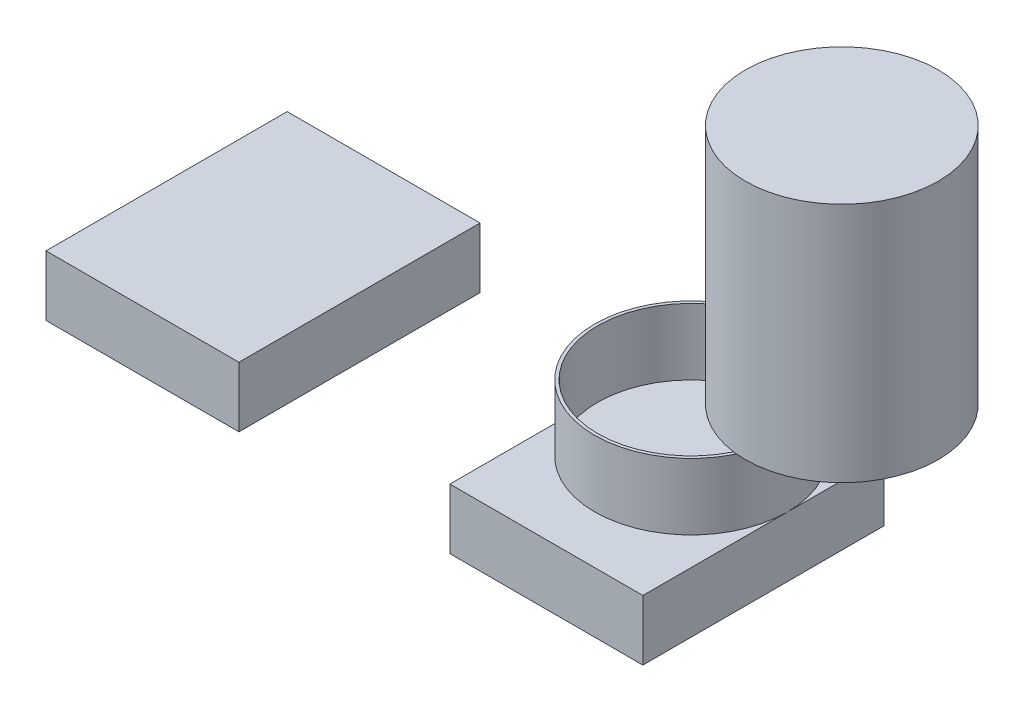
ISO-10303-21;
HEADER;
FILE_DESCRIPTION(('STEP AP214'),'2;1');
FILE_NAME('part.step','',(''),(''),'','','');
FILE_SCHEMA(('AUTOMOTIVE_DESIGN { 1 0 10303 214 1 1 1 1 }'));
ENDSEC;
DATA;
#1=APPLICATION_CONTEXT('core data for automotive mechanical design processes');
#2=APPLICATION_PROTOCOL_DEFINITION('international standard','automotive_design',2000,#1);
#3=PRODUCT_CONTEXT('',#1,'mechanical');
#4=PRODUCT('Part','Part','',(#3));
#5=PRODUCT_RELATED_PRODUCT_CATEGORY('part','',(#4));
#6=PRODUCT_DEFINITION_FORMATION('','',#4);
#7=PRODUCT_DEFINITION_CONTEXT('part definition',#1,'design');
#8=PRODUCT_DEFINITION('design','',#6,#7);
#9=PRODUCT_DEFINITION_SHAPE('','',#8);
#10=(LENGTH_UNIT() NAMED_UNIT(*) SI_UNIT(.MILLI.,.METRE.));
#11=(NAMED_UNIT(*) PLANE_ANGLE_UNIT() SI_UNIT($,.RADIAN.));
#12=(NAMED_UNIT(*) SI_UNIT($,.STERADIAN.) SOLID_ANGLE_UNIT());
#13=UNCERTAINTY_MEASURE_WITH_UNIT(LENGTH_MEASURE(1.E-05),#10,'distance_accuracy_value','');
#14=(GEOMETRIC_REPRESENTATION_CONTEXT(3) GLOBAL_UNCERTAINTY_ASSIGNED_CONTEXT((#13)) GLOBAL_UNIT_ASSIGNED_CONTEXT((#10,
#11,#12)) REPRESENTATION_CONTEXT('',''));
#15=CARTESIAN_POINT('',(0.,0.,0.));
#16=DIRECTION('',(0.,0.,1.));
#17=DIRECTION('',(1.,0.,0.));
#18=AXIS2_PLACEMENT_3D('',#15,#16,#17);
#19=CARTESIAN_POINT('',(250.,700.,0.));
#20=DIRECTION('',(0.,-1.,0.));
#21=DIRECTION('',(0.,0.,-1.));
#22=AXIS2_PLACEMENT_3D('',#19,#20,#21);
#23=CYLINDRICAL_SURFACE('',#22,160.);
#24=CARTESIAN_POINT('',(250.,700.,0.));
#25=DIRECTION('',(0.,1.,0.));
#26=DIRECTION('',(0.,0.,1.));
#27=AXIS2_PLACEMENT_3D('',#24,#25,#26);
#28=CIRCLE('',#27,160.);
#29=CARTESIAN_POINT('',(250.,700.,160.));
#30=VERTEX_POINT('',#29);
#31=EDGE_CURVE('E11',#30,#30,#28,.T.);
#32=ORIENTED_EDGE('',*,*,#31,.F.);
#33=EDGE_LOOP('',(#32));
#34=FACE_BOUND('',#33,.T.);
#35=CARTESIAN_POINT('',(250.,300.,0.));
#36=DIRECTION('',(0.,1.,0.));
#37=DIRECTION('',(0.,0.,1.));
#38=AXIS2_PLACEMENT_3D('',#35,#36,#37);
#39=CIRCLE('',#38,160.);
#40=CARTESIAN_POINT('',(250.,300.,160.));
#41=VERTEX_POINT('',#40);
#42=EDGE_CURVE('E45',#41,#41,#39,.T.);
#43=ORIENTED_EDGE('',*,*,#42,.T.);
#44=EDGE_LOOP('',(#43));
#45=FACE_BOUND('',#44,.T.);
#46=ADVANCED_FACE('F42',(#34,#45),#23,.T.);
#47=CARTESIAN_POINT('',(250.,700.,0.));
#48=DIRECTION('',(0.,1.,0.));
#49=DIRECTION('',(0.,0.,1.));
#50=AXIS2_PLACEMENT_3D('',#47,#48,#49);
#51=PLANE('',#50);
#52=ORIENTED_EDGE('',*,*,#31,.T.);
#53=EDGE_LOOP('',(#52));
#54=FACE_BOUND('',#53,.T.);
#55=ADVANCED_FACE('F57',(#54),#51,.T.);
#56=CARTESIAN_POINT('',(250.,300.,0.));
#57=DIRECTION('',(0.,1.,0.));
#58=DIRECTION('',(0.,0.,1.));
#59=AXIS2_PLACEMENT_3D('',#56,#57,#58);
#60=PLANE('',#59);
#61=ORIENTED_EDGE('',*,*,#42,.F.);
#62=EDGE_LOOP('',(#61));
#63=FACE_BOUND('',#62,.T.);
#64=ADVANCED_FACE('F55',(#63),#60,.F.);
#65=CLOSED_SHELL('',(#46,#55,#64));
#66=MANIFOLD_SOLID_BREP('B2',#65);
#67=CARTESIAN_POINT('',(-510.,100.,240.));
#68=DIRECTION('',(-1.,0.,0.));
#69=DIRECTION('',(0.,0.,1.));
#70=AXIS2_PLACEMENT_3D('',#67,#68,#69);
#71=PLANE('',#70);
#72=DIRECTION('',(0.,0.,-1.));
#73=VECTOR('',#72,1.);
#74=CARTESIAN_POINT('',(-510.,0.,240.));
#75=LINE('',#74,#73);
#76=CARTESIAN_POINT('',(-510.,0.,240.));
#77=VERTEX_POINT('',#76);
#78=CARTESIAN_POINT('',(-510.,0.,-160.));
#79=VERTEX_POINT('',#78);
#80=EDGE_CURVE('E155',#77,#79,#75,.T.);
#81=ORIENTED_EDGE('',*,*,#80,.T.);
#82=DIRECTION('',(0.,-1.,0.));
#83=VECTOR('',#82,1.);
#84=CARTESIAN_POINT('',(-510.,100.,-160.));
#85=LINE('',#84,#83);
#86=CARTESIAN_POINT('',(-510.,100.,-160.));
#87=VERTEX_POINT('',#86);
#88=EDGE_CURVE('E40',#87,#79,#85,.T.);
#89=ORIENTED_EDGE('',*,*,#88,.F.);
#90=DIRECTION('',(0.,0.,-1.));
#91=VECTOR('',#90,1.);
#92=CARTESIAN_POINT('',(-510.,100.,240.));
#93=LINE('',#92,#91);
#94=CARTESIAN_POINT('',(-510.,100.,240.));
#95=VERTEX_POINT('',#94);
#96=EDGE_CURVE('E143',#95,#87,#93,.T.);
#97=ORIENTED_EDGE('',*,*,#96,.F.);
#98=DIRECTION('',(0.,-1.,0.));
#99=VECTOR('',#98,1.);
#100=CARTESIAN_POINT('',(-510.,100.,240.));
#101=LINE('',#100,#99);
#102=EDGE_CURVE('E151',#95,#77,#101,.T.);
#103=ORIENTED_EDGE('',*,*,#102,.T.);
#104=EDGE_LOOP('',(#81,#89,#97,#103));
#105=FACE_BOUND('',#104,.T.);
#106=ADVANCED_FACE('F92',(#105),#71,.F.);
#107=CARTESIAN_POINT('',(-830.,100.,-160.));
#108=DIRECTION('',(0.,0.,1.));
#109=DIRECTION('',(1.,0.,0.));
#110=AXIS2_PLACEMENT_3D('',#107,#108,#109);
#111=PLANE('',#110);
#112=DIRECTION('',(-1.,0.,0.));
#113=VECTOR('',#112,1.);
#114=CARTESIAN_POINT('',(-830.,0.,-160.));
#115=LINE('',#114,#113);
#116=CARTESIAN_POINT('',(-830.,0.,-160.));
#117=VERTEX_POINT('',#116);
#118=EDGE_CURVE('E147',#79,#117,#115,.T.);
#119=ORIENTED_EDGE('',*,*,#118,.T.);
#120=DIRECTION('',(0.,-1.,0.));
#121=VECTOR('',#120,1.);
#122=CARTESIAN_POINT('',(-830.,100.,-160.));
#123=LINE('',#122,#121);
#124=CARTESIAN_POINT('',(-830.,100.,-160.));
#125=VERTEX_POINT('',#124);
#126=EDGE_CURVE('E100',#125,#117,#123,.T.);
#127=ORIENTED_EDGE('',*,*,#126,.F.);
#128=DIRECTION('',(-1.,0.,0.));
#129=VECTOR('',#128,1.);
#130=CARTESIAN_POINT('',(-830.,100.,-160.));
#131=LINE('',#130,#129);
#132=EDGE_CURVE('E138',#87,#125,#131,.T.);
#133=ORIENTED_EDGE('',*,*,#132,.F.);
#134=ORIENTED_EDGE('',*,*,#88,.T.);
#135=EDGE_LOOP('',(#119,#127,#133,#134));
#136=FACE_BOUND('',#135,.T.);
#137=ADVANCED_FACE('F146',(#136),#111,.F.);
#138=CARTESIAN_POINT('',(-830.,100.,240.));
#139=DIRECTION('',(1.,0.,0.));
#140=DIRECTION('',(0.,0.,-1.));
#141=AXIS2_PLACEMENT_3D('',#138,#139,#140);
#142=PLANE('',#141);
#143=DIRECTION('',(0.,0.,1.));
#144=VECTOR('',#143,1.);
#145=CARTESIAN_POINT('',(-830.,0.,240.));
#146=LINE('',#145,#144);
#147=CARTESIAN_POINT('',(-830.,0.,240.));
#148=VERTEX_POINT('',#147);
#149=EDGE_CURVE('E125',#117,#148,#146,.T.);
#150=ORIENTED_EDGE('',*,*,#149,.T.);
#151=DIRECTION('',(0.,-1.,0.));
#152=VECTOR('',#151,1.);
#153=CARTESIAN_POINT('',(-830.,100.,240.));
#154=LINE('',#153,#152);
#155=CARTESIAN_POINT('',(-830.,100.,240.));
#156=VERTEX_POINT('',#155);
#157=EDGE_CURVE('E148',#156,#148,#154,.T.);
#158=ORIENTED_EDGE('',*,*,#157,.F.);
#159=DIRECTION('',(0.,0.,1.));
#160=VECTOR('',#159,1.);
#161=CARTESIAN_POINT('',(-830.,100.,240.));
#162=LINE('',#161,#160);
#163=EDGE_CURVE('E141',#125,#156,#162,.T.);
#164=ORIENTED_EDGE('',*,*,#163,.F.);
#165=ORIENTED_EDGE('',*,*,#126,.T.);
#166=EDGE_LOOP('',(#150,#158,#164,#165));
#167=FACE_BOUND('',#166,.T.);
#168=ADVANCED_FACE('F149',(#167),#142,.F.);
#169=CARTESIAN_POINT('',(-830.,100.,240.));
#170=DIRECTION('',(0.,0.,-1.));
#171=DIRECTION('',(-1.,0.,0.));
#172=AXIS2_PLACEMENT_3D('',#169,#170,#171);
#173=PLANE('',#172);
#174=DIRECTION('',(1.,0.,0.));
#175=VECTOR('',#174,1.);
#176=CARTESIAN_POINT('',(-830.,0.,240.));
#177=LINE('',#176,#175);
#178=EDGE_CURVE('E131',#148,#77,#177,.T.);
#179=ORIENTED_EDGE('',*,*,#178,.T.);
#180=ORIENTED_EDGE('',*,*,#102,.F.);
#181=DIRECTION('',(1.,0.,0.));
#182=VECTOR('',#181,1.);
#183=CARTESIAN_POINT('',(-830.,100.,240.));
#184=LINE('',#183,#182);
#185=EDGE_CURVE('E108',#156,#95,#184,.T.);
#186=ORIENTED_EDGE('',*,*,#185,.F.);
#187=ORIENTED_EDGE('',*,*,#157,.T.);
#188=EDGE_LOOP('',(#179,#180,#186,#187));
#189=FACE_BOUND('',#188,.T.);
#190=ADVANCED_FACE('F162',(#189),#173,.F.);
#191=CARTESIAN_POINT('',(0.,100.,0.));
#192=DIRECTION('',(0.,-1.,0.));
#193=DIRECTION('',(0.,0.,-1.));
#194=AXIS2_PLACEMENT_3D('',#191,#192,#193);
#195=PLANE('',#194);
#196=ORIENTED_EDGE('',*,*,#96,.T.);
#197=ORIENTED_EDGE('',*,*,#132,.T.);
#198=ORIENTED_EDGE('',*,*,#163,.T.);
#199=ORIENTED_EDGE('',*,*,#185,.T.);
#200=EDGE_LOOP('',(#196,#197,#198,#199));
#201=FACE_BOUND('',#200,.T.);
#202=ADVANCED_FACE('F139',(#201),#195,.F.);
#203=CARTESIAN_POINT('',(0.,0.,0.));
#204=DIRECTION('',(0.,-1.,0.));
#205=DIRECTION('',(0.,0.,-1.));
#206=AXIS2_PLACEMENT_3D('',#203,#204,#205);
#207=PLANE('',#206);
#208=ORIENTED_EDGE('',*,*,#80,.F.);
#209=ORIENTED_EDGE('',*,*,#178,.F.);
#210=ORIENTED_EDGE('',*,*,#149,.F.);
#211=ORIENTED_EDGE('',*,*,#118,.F.);
#212=EDGE_LOOP('',(#208,#209,#210,#211));
#213=FACE_BOUND('',#212,.T.);
#214=ADVANCED_FACE('F165',(#213),#207,.T.);
#215=CLOSED_SHELL('',(#106,#137,#168,#190,#202,#214));
#216=MANIFOLD_SOLID_BREP('B6',#215);
#217=CARTESIAN_POINT('',(0.,100.,0.));
#218=DIRECTION('',(0.,-1.,0.));
#219=DIRECTION('',(0.,0.,-1.));
#220=AXIS2_PLACEMENT_3D('',#217,#218,#219);
#221=PLANE('',#220);
#222=CARTESIAN_POINT('',(0.,100.,0.));
#223=DIRECTION('',(0.,1.,0.));
#224=DIRECTION('',(0.,0.,1.));
#225=AXIS2_PLACEMENT_3D('',#222,#223,#224);
#226=CIRCLE('',#225,160.);
#227=CARTESIAN_POINT('',(160.,100.,0.));
#228=VERTEX_POINT('',#227);
#229=CARTESIAN_POINT('',(0.,100.,-160.));
#230=VERTEX_POINT('',#229);
#231=EDGE_CURVE('E227',#228,#230,#226,.T.);
#232=ORIENTED_EDGE('',*,*,#231,.F.);
#233=DIRECTION('',(0.,0.,-1.));
#234=VECTOR('',#233,1.);
#235=CARTESIAN_POINT('',(160.,100.,240.));
#236=LINE('',#235,#234);
#237=CARTESIAN_POINT('',(160.,100.,-160.));
#238=VERTEX_POINT('',#237);
#239=EDGE_CURVE('E274',#228,#238,#236,.T.);
#240=ORIENTED_EDGE('',*,*,#239,.T.);
#241=DIRECTION('',(-1.,0.,0.));
#242=VECTOR('',#241,1.);
#243=CARTESIAN_POINT('',(-160.,100.,-160.));
#244=LINE('',#243,#242);
#245=EDGE_CURVE('E285',#238,#230,#244,.T.);
#246=ORIENTED_EDGE('',*,*,#245,.T.);
#247=EDGE_LOOP('',(#232,#240,#246));
#248=FACE_BOUND('',#247,.T.);
#249=ADVANCED_FACE('F216',(#248),#221,.F.);
#250=CARTESIAN_POINT('',(-160.,100.,0.));
#251=VERTEX_POINT('',#250);
#252=EDGE_CURVE('E90',#230,#251,#226,.T.);
#253=ORIENTED_EDGE('',*,*,#252,.F.);
#254=CARTESIAN_POINT('',(-160.,100.,-160.));
#255=VERTEX_POINT('',#254);
#256=EDGE_CURVE('E273',#230,#255,#244,.T.);
#257=ORIENTED_EDGE('',*,*,#256,.T.);
#258=DIRECTION('',(0.,0.,1.));
#259=VECTOR('',#258,1.);
#260=CARTESIAN_POINT('',(-160.,100.,240.));
#261=LINE('',#260,#259);
#262=EDGE_CURVE('E296',#255,#251,#261,.T.);
#263=ORIENTED_EDGE('',*,*,#262,.T.);
#264=EDGE_LOOP('',(#253,#257,#263));
#265=FACE_BOUND('',#264,.T.);
#266=ADVANCED_FACE('F324',(#265),#221,.F.);
#267=CARTESIAN_POINT('',(160.,100.,240.));
#268=DIRECTION('',(-1.,0.,0.));
#269=DIRECTION('',(0.,0.,1.));
#270=AXIS2_PLACEMENT_3D('',#267,#268,#269);
#271=PLANE('',#270);
#272=DIRECTION('',(0.,0.,-1.));
#273=VECTOR('',#272,1.);
#274=CARTESIAN_POINT('',(160.,0.,240.));
#275=LINE('',#274,#273);
#276=CARTESIAN_POINT('',(160.,0.,240.));
#277=VERTEX_POINT('',#276);
#278=CARTESIAN_POINT('',(160.,0.,-160.));
#279=VERTEX_POINT('',#278);
#280=EDGE_CURVE('E300',#277,#279,#275,.T.);
#281=ORIENTED_EDGE('',*,*,#280,.T.);
#282=DIRECTION('',(0.,-1.,0.));
#283=VECTOR('',#282,1.);
#284=CARTESIAN_POINT('',(160.,100.,-160.));
#285=LINE('',#284,#283);
#286=EDGE_CURVE('E220',#238,#279,#285,.T.);
#287=ORIENTED_EDGE('',*,*,#286,.F.);
#288=ORIENTED_EDGE('',*,*,#239,.F.);
#289=CARTESIAN_POINT('',(160.,100.,240.));
#290=VERTEX_POINT('',#289);
#291=EDGE_CURVE('E265',#290,#228,#236,.T.);
#292=ORIENTED_EDGE('',*,*,#291,.F.);
#293=DIRECTION('',(0.,-1.,0.));
#294=VECTOR('',#293,1.);
#295=CARTESIAN_POINT('',(160.,100.,240.));
#296=LINE('',#295,#294);
#297=EDGE_CURVE('E299',#290,#277,#296,.T.);
#298=ORIENTED_EDGE('',*,*,#297,.T.);
#299=EDGE_LOOP('',(#281,#287,#288,#292,#298));
#300=FACE_BOUND('',#299,.T.);
#301=ADVANCED_FACE('F218',(#300),#271,.F.);
#302=CARTESIAN_POINT('',(-160.,100.,-160.));
#303=DIRECTION('',(0.,0.,1.));
#304=DIRECTION('',(1.,0.,0.));
#305=AXIS2_PLACEMENT_3D('',#302,#303,#304);
#306=PLANE('',#305);
#307=DIRECTION('',(-1.,0.,0.));
#308=VECTOR('',#307,1.);
#309=CARTESIAN_POINT('',(-160.,0.,-160.));
#310=LINE('',#309,#308);
#311=CARTESIAN_POINT('',(-160.,0.,-160.));
#312=VERTEX_POINT('',#311);
#313=EDGE_CURVE('E302',#279,#312,#310,.T.);
#314=ORIENTED_EDGE('',*,*,#313,.T.);
#315=DIRECTION('',(0.,-1.,0.));
#316=VECTOR('',#315,1.);
#317=CARTESIAN_POINT('',(-160.,100.,-160.));
#318=LINE('',#317,#316);
#319=EDGE_CURVE('E290',#255,#312,#318,.T.);
#320=ORIENTED_EDGE('',*,*,#319,.F.);
#321=ORIENTED_EDGE('',*,*,#256,.F.);
#322=ORIENTED_EDGE('',*,*,#245,.F.);
#323=ORIENTED_EDGE('',*,*,#286,.T.);
#324=EDGE_LOOP('',(#314,#320,#321,#322,#323));
#325=FACE_BOUND('',#324,.T.);
#326=ADVANCED_FACE('F325',(#325),#306,.F.);
#327=CARTESIAN_POINT('',(-160.,100.,240.));
#328=DIRECTION('',(1.,0.,0.));
#329=DIRECTION('',(0.,0.,-1.));
#330=AXIS2_PLACEMENT_3D('',#327,#328,#329);
#331=PLANE('',#330);
#332=DIRECTION('',(0.,0.,1.));
#333=VECTOR('',#332,1.);
#334=CARTESIAN_POINT('',(-160.,0.,240.));
#335=LINE('',#334,#333);
#336=CARTESIAN_POINT('',(-160.,0.,240.));
#337=VERTEX_POINT('',#336);
#338=EDGE_CURVE('E304',#312,#337,#335,.T.);
#339=ORIENTED_EDGE('',*,*,#338,.T.);
#340=DIRECTION('',(0.,-1.,0.));
#341=VECTOR('',#340,1.);
#342=CARTESIAN_POINT('',(-160.,100.,240.));
#343=LINE('',#342,#341);
#344=CARTESIAN_POINT('',(-160.,100.,240.));
#345=VERTEX_POINT('',#344);
#346=EDGE_CURVE('E308',#345,#337,#343,.T.);
#347=ORIENTED_EDGE('',*,*,#346,.F.);
#348=EDGE_CURVE('E295',#251,#345,#261,.T.);
#349=ORIENTED_EDGE('',*,*,#348,.F.);
#350=ORIENTED_EDGE('',*,*,#262,.F.);
#351=ORIENTED_EDGE('',*,*,#319,.T.);
#352=EDGE_LOOP('',(#339,#347,#349,#350,#351));
#353=FACE_BOUND('',#352,.T.);
#354=ADVANCED_FACE('F315',(#353),#331,.F.);
#355=CARTESIAN_POINT('',(-160.,100.,240.));
#356=DIRECTION('',(0.,0.,-1.));
#357=DIRECTION('',(-1.,0.,0.));
#358=AXIS2_PLACEMENT_3D('',#355,#356,#357);
#359=PLANE('',#358);
#360=DIRECTION('',(1.,0.,0.));
#361=VECTOR('',#360,1.);
#362=CARTESIAN_POINT('',(-160.,0.,240.));
#363=LINE('',#362,#361);
#364=EDGE_CURVE('E283',#337,#277,#363,.T.);
#365=ORIENTED_EDGE('',*,*,#364,.T.);
#366=ORIENTED_EDGE('',*,*,#297,.F.);
#367=DIRECTION('',(1.,0.,0.));
#368=VECTOR('',#367,1.);
#369=CARTESIAN_POINT('',(-160.,100.,240.));
#370=LINE('',#369,#368);
#371=EDGE_CURVE('E269',#345,#290,#370,.T.);
#372=ORIENTED_EDGE('',*,*,#371,.F.);
#373=ORIENTED_EDGE('',*,*,#346,.T.);
#374=EDGE_LOOP('',(#365,#366,#372,#373));
#375=FACE_BOUND('',#374,.T.);
#376=ADVANCED_FACE('F323',(#375),#359,.F.);
#377=EDGE_CURVE('E225',#251,#228,#226,.T.);
#378=ORIENTED_EDGE('',*,*,#377,.F.);
#379=ORIENTED_EDGE('',*,*,#348,.T.);
#380=ORIENTED_EDGE('',*,*,#371,.T.);
#381=ORIENTED_EDGE('',*,*,#291,.T.);
#382=EDGE_LOOP('',(#378,#379,#380,#381));
#383=FACE_BOUND('',#382,.T.);
#384=ADVANCED_FACE('F267',(#383),#221,.F.);
#385=CARTESIAN_POINT('',(0.,0.,0.));
#386=DIRECTION('',(0.,-1.,0.));
#387=DIRECTION('',(0.,0.,-1.));
#388=AXIS2_PLACEMENT_3D('',#385,#386,#387);
#389=PLANE('',#388);
#390=ORIENTED_EDGE('',*,*,#280,.F.);
#391=ORIENTED_EDGE('',*,*,#364,.F.);
#392=ORIENTED_EDGE('',*,*,#338,.F.);
#393=ORIENTED_EDGE('',*,*,#313,.F.);
#394=EDGE_LOOP('',(#390,#391,#392,#393));
#395=FACE_BOUND('',#394,.T.);
#396=ADVANCED_FACE('F321',(#395),#389,.T.);
#397=CARTESIAN_POINT('',(0.,210.,0.));
#398=DIRECTION('',(0.,1.,0.));
#399=DIRECTION('',(0.,0.,1.));
#400=AXIS2_PLACEMENT_3D('',#397,#398,#399);
#401=PLANE('',#400);
#402=CARTESIAN_POINT('',(0.,210.,0.));
#403=DIRECTION('',(0.,1.,0.));
#404=DIRECTION('',(0.,0.,1.));
#405=AXIS2_PLACEMENT_3D('',#402,#403,#404);
#406=CIRCLE('',#405,160.);
#407=CARTESIAN_POINT('',(0.,210.,160.));
#408=VERTEX_POINT('',#407);
#409=EDGE_CURVE('E287',#408,#408,#406,.T.);
#410=ORIENTED_EDGE('',*,*,#409,.T.);
#411=EDGE_LOOP('',(#410));
#412=FACE_BOUND('',#411,.T.);
#413=CARTESIAN_POINT('',(0.,210.,0.));
#414=DIRECTION('',(0.,1.,0.));
#415=DIRECTION('',(0.,0.,1.));
#416=AXIS2_PLACEMENT_3D('',#413,#414,#415);
#417=CIRCLE('',#416,155.);
#418=CARTESIAN_POINT('',(0.,210.,155.));
#419=VERTEX_POINT('',#418);
#420=EDGE_CURVE('E288',#419,#419,#417,.T.);
#421=ORIENTED_EDGE('',*,*,#420,.F.);
#422=EDGE_LOOP('',(#421));
#423=FACE_BOUND('',#422,.T.);
#424=ADVANCED_FACE('F345',(#412,#423),#401,.T.);
#425=CARTESIAN_POINT('',(0.,210.,0.));
#426=DIRECTION('',(0.,-1.,0.));
#427=DIRECTION('',(0.,0.,-1.));
#428=AXIS2_PLACEMENT_3D('',#425,#426,#427);
#429=CYLINDRICAL_SURFACE('',#428,160.);
#430=ORIENTED_EDGE('',*,*,#409,.F.);
#431=EDGE_LOOP('',(#430));
#432=FACE_BOUND('',#431,.T.);
#433=ORIENTED_EDGE('',*,*,#231,.T.);
#434=ORIENTED_EDGE('',*,*,#252,.T.);
#435=ORIENTED_EDGE('',*,*,#377,.T.);
#436=EDGE_LOOP('',(#433,#434,#435));
#437=FACE_BOUND('',#436,.T.);
#438=ADVANCED_FACE('F289',(#432,#437),#429,.T.);
#439=CARTESIAN_POINT('',(0.,210.,0.));
#440=DIRECTION('',(0.,-1.,0.));
#441=DIRECTION('',(0.,0.,-1.));
#442=AXIS2_PLACEMENT_3D('',#439,#440,#441);
#443=CYLINDRICAL_SURFACE('',#442,155.);
#444=ORIENTED_EDGE('',*,*,#420,.T.);
#445=EDGE_LOOP('',(#444));
#446=FACE_BOUND('',#445,.T.);
#447=CARTESIAN_POINT('',(0.,100.,0.));
#448=DIRECTION('',(0.,1.,0.));
#449=DIRECTION('',(0.,0.,1.));
#450=AXIS2_PLACEMENT_3D('',#447,#448,#449);
#451=CIRCLE('',#450,155.);
#452=CARTESIAN_POINT('',(0.,100.,155.));
#453=VERTEX_POINT('',#452);
#454=EDGE_CURVE('E357',#453,#453,#451,.T.);
#455=ORIENTED_EDGE('',*,*,#454,.F.);
#456=EDGE_LOOP('',(#455));
#457=FACE_BOUND('',#456,.T.);
#458=ADVANCED_FACE('F348',(#446,#457),#443,.F.);
#459=ORIENTED_EDGE('',*,*,#454,.T.);
#460=EDGE_LOOP('',(#459));
#461=FACE_BOUND('',#460,.T.);
#462=ADVANCED_FACE('F337',(#461),#221,.F.);
#463=CLOSED_SHELL('',(#249,#266,#301,#326,#354,#376,#384,#396,#424,#438,#458,#462));
#464=MANIFOLD_SOLID_BREP('B34',#463);
#465=ADVANCED_BREP_SHAPE_REPRESENTATION('',(#18,#66,#216,#464),#14);
#466=SHAPE_DEFINITION_REPRESENTATION(#9,#465);
ENDSEC;
END-ISO-10303-21;
